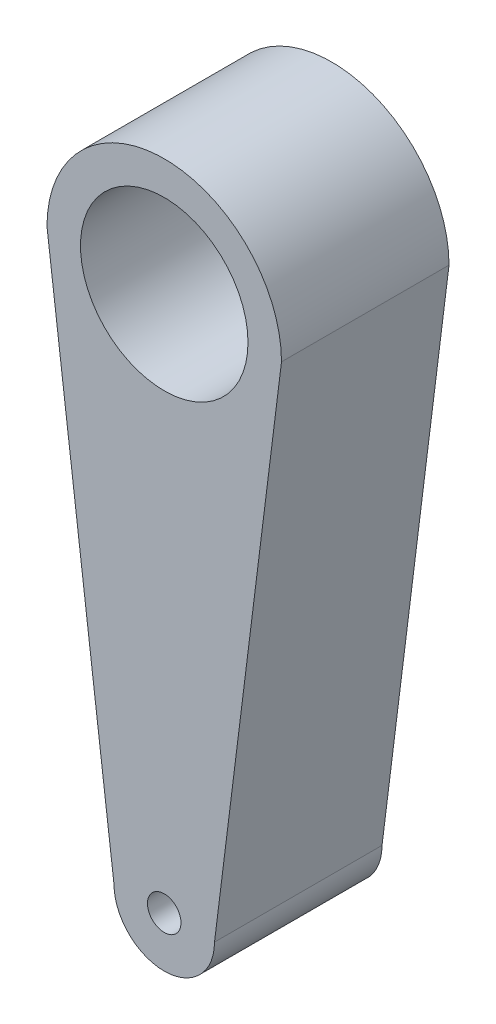
ISO-10303-21;
HEADER;
FILE_DESCRIPTION(('STEP AP214'),'2;1');
FILE_NAME('part.step','',(''),(''),'','','');
FILE_SCHEMA(('AUTOMOTIVE_DESIGN { 1 0 10303 214 1 1 1 1 }'));
ENDSEC;
DATA;
#1=APPLICATION_CONTEXT('core data for automotive mechanical design processes');
#2=APPLICATION_PROTOCOL_DEFINITION('international standard','automotive_design',2000,#1);
#3=PRODUCT_CONTEXT('',#1,'mechanical');
#4=PRODUCT('Part','Part','',(#3));
#5=PRODUCT_RELATED_PRODUCT_CATEGORY('part','',(#4));
#6=PRODUCT_DEFINITION_FORMATION('','',#4);
#7=PRODUCT_DEFINITION_CONTEXT('part definition',#1,'design');
#8=PRODUCT_DEFINITION('design','',#6,#7);
#9=PRODUCT_DEFINITION_SHAPE('','',#8);
#10=(LENGTH_UNIT() NAMED_UNIT(*) SI_UNIT(.MILLI.,.METRE.));
#11=(NAMED_UNIT(*) PLANE_ANGLE_UNIT() SI_UNIT($,.RADIAN.));
#12=(NAMED_UNIT(*) SI_UNIT($,.STERADIAN.) SOLID_ANGLE_UNIT());
#13=UNCERTAINTY_MEASURE_WITH_UNIT(LENGTH_MEASURE(1.E-05),#10,'distance_accuracy_value','');
#14=(GEOMETRIC_REPRESENTATION_CONTEXT(3) GLOBAL_UNCERTAINTY_ASSIGNED_CONTEXT((#13)) GLOBAL_UNIT_ASSIGNED_CONTEXT((#10,
#11,#12)) REPRESENTATION_CONTEXT('',''));
#15=CARTESIAN_POINT('',(0.,0.,0.));
#16=DIRECTION('',(0.,0.,1.));
#17=DIRECTION('',(1.,0.,0.));
#18=AXIS2_PLACEMENT_3D('',#15,#16,#17);
#19=CARTESIAN_POINT('',(0.,0.,5.));
#20=DIRECTION('',(0.,0.,1.));
#21=DIRECTION('',(1.,0.,0.));
#22=AXIS2_PLACEMENT_3D('',#19,#20,#21);
#23=PLANE('',#22);
#24=CARTESIAN_POINT('',(0.,0.,5.));
#25=DIRECTION('',(0.,0.,1.));
#26=DIRECTION('',(1.,0.,0.));
#27=AXIS2_PLACEMENT_3D('',#24,#25,#26);
#28=CIRCLE('',#27,2.5);
#29=CARTESIAN_POINT('',(2.5,0.,5.));
#30=VERTEX_POINT('',#29);
#31=EDGE_CURVE('E100',#30,#30,#28,.T.);
#32=ORIENTED_EDGE('',*,*,#31,.F.);
#33=EDGE_LOOP('',(#32));
#34=FACE_BOUND('',#33,.T.);
#35=CARTESIAN_POINT('',(0.,0.,5.));
#36=DIRECTION('',(0.,0.,1.));
#37=DIRECTION('',(1.,0.,0.));
#38=AXIS2_PLACEMENT_3D('',#35,#36,#37);
#39=CIRCLE('',#38,3.5);
#40=CARTESIAN_POINT('',(3.5,0.,5.));
#41=VERTEX_POINT('',#40);
#42=CARTESIAN_POINT('',(-3.5,0.,5.));
#43=VERTEX_POINT('',#42);
#44=EDGE_CURVE('E85',#41,#43,#39,.T.);
#45=ORIENTED_EDGE('',*,*,#44,.T.);
#46=DIRECTION('',(0.124034734589208,-0.992277876713668,0.));
#47=VECTOR('',#46,1.);
#48=CARTESIAN_POINT('',(-3.5,0.,5.));
#49=LINE('',#48,#47);
#50=CARTESIAN_POINT('',(-1.5,-16.,5.));
#51=VERTEX_POINT('',#50);
#52=EDGE_CURVE('E80',#43,#51,#49,.T.);
#53=ORIENTED_EDGE('',*,*,#52,.T.);
#54=CARTESIAN_POINT('',(0.,-16.,5.));
#55=DIRECTION('',(0.,0.,1.));
#56=DIRECTION('',(1.,0.,0.));
#57=AXIS2_PLACEMENT_3D('',#54,#55,#56);
#58=CIRCLE('',#57,1.5);
#59=CARTESIAN_POINT('',(1.5,-16.,5.));
#60=VERTEX_POINT('',#59);
#61=EDGE_CURVE('E83',#51,#60,#58,.T.);
#62=ORIENTED_EDGE('',*,*,#61,.T.);
#63=DIRECTION('',(0.124034734589208,0.992277876713668,0.));
#64=VECTOR('',#63,1.);
#65=CARTESIAN_POINT('',(3.5,0.,5.));
#66=LINE('',#65,#64);
#67=EDGE_CURVE('E50',#60,#41,#66,.T.);
#68=ORIENTED_EDGE('',*,*,#67,.T.);
#69=EDGE_LOOP('',(#45,#53,#62,#68));
#70=FACE_BOUND('',#69,.T.);
#71=CARTESIAN_POINT('',(0.,-16.,5.));
#72=DIRECTION('',(0.,0.,1.));
#73=DIRECTION('',(1.,0.,0.));
#74=AXIS2_PLACEMENT_3D('',#71,#72,#73);
#75=CIRCLE('',#74,0.5);
#76=CARTESIAN_POINT('',(0.5,-16.,5.));
#77=VERTEX_POINT('',#76);
#78=EDGE_CURVE('E115',#77,#77,#75,.T.);
#79=ORIENTED_EDGE('',*,*,#78,.F.);
#80=EDGE_LOOP('',(#79));
#81=FACE_BOUND('',#80,.T.);
#82=ADVANCED_FACE('F33',(#34,#70,#81),#23,.T.);
#83=CARTESIAN_POINT('',(0.,0.,0.));
#84=DIRECTION('',(0.,0.,1.));
#85=DIRECTION('',(1.,0.,0.));
#86=AXIS2_PLACEMENT_3D('',#83,#84,#85);
#87=PLANE('',#86);
#88=CARTESIAN_POINT('',(0.,0.,0.));
#89=DIRECTION('',(0.,0.,1.));
#90=DIRECTION('',(1.,0.,0.));
#91=AXIS2_PLACEMENT_3D('',#88,#89,#90);
#92=CIRCLE('',#91,3.5);
#93=CARTESIAN_POINT('',(3.5,0.,0.));
#94=VERTEX_POINT('',#93);
#95=CARTESIAN_POINT('',(-3.5,0.,0.));
#96=VERTEX_POINT('',#95);
#97=EDGE_CURVE('E97',#94,#96,#92,.T.);
#98=ORIENTED_EDGE('',*,*,#97,.F.);
#99=DIRECTION('',(0.124034734589208,0.992277876713668,0.));
#100=VECTOR('',#99,1.);
#101=CARTESIAN_POINT('',(3.5,0.,0.));
#102=LINE('',#101,#100);
#103=CARTESIAN_POINT('',(1.5,-16.,0.));
#104=VERTEX_POINT('',#103);
#105=EDGE_CURVE('E73',#104,#94,#102,.T.);
#106=ORIENTED_EDGE('',*,*,#105,.F.);
#107=CARTESIAN_POINT('',(0.,-16.,0.));
#108=DIRECTION('',(0.,0.,1.));
#109=DIRECTION('',(1.,0.,0.));
#110=AXIS2_PLACEMENT_3D('',#107,#108,#109);
#111=CIRCLE('',#110,1.5);
#112=CARTESIAN_POINT('',(-1.5,-16.,0.));
#113=VERTEX_POINT('',#112);
#114=EDGE_CURVE('E67',#113,#104,#111,.T.);
#115=ORIENTED_EDGE('',*,*,#114,.F.);
#116=DIRECTION('',(0.124034734589208,-0.992277876713668,0.));
#117=VECTOR('',#116,1.);
#118=CARTESIAN_POINT('',(-3.5,0.,0.));
#119=LINE('',#118,#117);
#120=EDGE_CURVE('E89',#96,#113,#119,.T.);
#121=ORIENTED_EDGE('',*,*,#120,.F.);
#122=EDGE_LOOP('',(#98,#106,#115,#121));
#123=FACE_BOUND('',#122,.T.);
#124=CARTESIAN_POINT('',(0.,0.,0.));
#125=DIRECTION('',(0.,0.,1.));
#126=DIRECTION('',(1.,0.,0.));
#127=AXIS2_PLACEMENT_3D('',#124,#125,#126);
#128=CIRCLE('',#127,2.5);
#129=CARTESIAN_POINT('',(2.5,0.,0.));
#130=VERTEX_POINT('',#129);
#131=EDGE_CURVE('E112',#130,#130,#128,.T.);
#132=ORIENTED_EDGE('',*,*,#131,.T.);
#133=EDGE_LOOP('',(#132));
#134=FACE_BOUND('',#133,.T.);
#135=CARTESIAN_POINT('',(0.,-16.,0.));
#136=DIRECTION('',(0.,0.,1.));
#137=DIRECTION('',(1.,0.,0.));
#138=AXIS2_PLACEMENT_3D('',#135,#136,#137);
#139=CIRCLE('',#138,0.5);
#140=CARTESIAN_POINT('',(0.5,-16.,0.));
#141=VERTEX_POINT('',#140);
#142=EDGE_CURVE('E118',#141,#141,#139,.T.);
#143=ORIENTED_EDGE('',*,*,#142,.T.);
#144=EDGE_LOOP('',(#143));
#145=FACE_BOUND('',#144,.T.);
#146=ADVANCED_FACE('F108',(#123,#134,#145),#87,.F.);
#147=CARTESIAN_POINT('',(0.,0.,5.));
#148=DIRECTION('',(0.,0.,-1.));
#149=DIRECTION('',(-1.,0.,0.));
#150=AXIS2_PLACEMENT_3D('',#147,#148,#149);
#151=CYLINDRICAL_SURFACE('',#150,3.5);
#152=ORIENTED_EDGE('',*,*,#97,.T.);
#153=DIRECTION('',(0.,0.,-1.));
#154=VECTOR('',#153,1.);
#155=CARTESIAN_POINT('',(-3.5,0.,5.));
#156=LINE('',#155,#154);
#157=EDGE_CURVE('E11',#43,#96,#156,.T.);
#158=ORIENTED_EDGE('',*,*,#157,.F.);
#159=ORIENTED_EDGE('',*,*,#44,.F.);
#160=DIRECTION('',(0.,0.,-1.));
#161=VECTOR('',#160,1.);
#162=CARTESIAN_POINT('',(3.5,0.,5.));
#163=LINE('',#162,#161);
#164=EDGE_CURVE('E93',#41,#94,#163,.T.);
#165=ORIENTED_EDGE('',*,*,#164,.T.);
#166=EDGE_LOOP('',(#152,#158,#159,#165));
#167=FACE_BOUND('',#166,.T.);
#168=ADVANCED_FACE('F35',(#167),#151,.T.);
#169=CARTESIAN_POINT('',(-3.5,0.,5.));
#170=DIRECTION('',(0.992277876713668,0.124034734589208,0.));
#171=DIRECTION('',(-0.124034734589208,0.992277876713668,0.));
#172=AXIS2_PLACEMENT_3D('',#169,#170,#171);
#173=PLANE('',#172);
#174=ORIENTED_EDGE('',*,*,#120,.T.);
#175=DIRECTION('',(0.,0.,-1.));
#176=VECTOR('',#175,1.);
#177=CARTESIAN_POINT('',(-1.5,-16.,5.));
#178=LINE('',#177,#176);
#179=EDGE_CURVE('E42',#51,#113,#178,.T.);
#180=ORIENTED_EDGE('',*,*,#179,.F.);
#181=ORIENTED_EDGE('',*,*,#52,.F.);
#182=ORIENTED_EDGE('',*,*,#157,.T.);
#183=EDGE_LOOP('',(#174,#180,#181,#182));
#184=FACE_BOUND('',#183,.T.);
#185=ADVANCED_FACE('F88',(#184),#173,.F.);
#186=CARTESIAN_POINT('',(0.,-16.,5.));
#187=DIRECTION('',(0.,0.,-1.));
#188=DIRECTION('',(-1.,0.,0.));
#189=AXIS2_PLACEMENT_3D('',#186,#187,#188);
#190=CYLINDRICAL_SURFACE('',#189,1.5);
#191=ORIENTED_EDGE('',*,*,#114,.T.);
#192=DIRECTION('',(0.,0.,-1.));
#193=VECTOR('',#192,1.);
#194=CARTESIAN_POINT('',(1.5,-16.,5.));
#195=LINE('',#194,#193);
#196=EDGE_CURVE('E90',#60,#104,#195,.T.);
#197=ORIENTED_EDGE('',*,*,#196,.F.);
#198=ORIENTED_EDGE('',*,*,#61,.F.);
#199=ORIENTED_EDGE('',*,*,#179,.T.);
#200=EDGE_LOOP('',(#191,#197,#198,#199));
#201=FACE_BOUND('',#200,.T.);
#202=ADVANCED_FACE('F91',(#201),#190,.T.);
#203=CARTESIAN_POINT('',(3.5,0.,5.));
#204=DIRECTION('',(-0.992277876713668,0.124034734589208,0.));
#205=DIRECTION('',(-0.124034734589208,-0.992277876713668,0.));
#206=AXIS2_PLACEMENT_3D('',#203,#204,#205);
#207=PLANE('',#206);
#208=ORIENTED_EDGE('',*,*,#105,.T.);
#209=ORIENTED_EDGE('',*,*,#164,.F.);
#210=ORIENTED_EDGE('',*,*,#67,.F.);
#211=ORIENTED_EDGE('',*,*,#196,.T.);
#212=EDGE_LOOP('',(#208,#209,#210,#211));
#213=FACE_BOUND('',#212,.T.);
#214=ADVANCED_FACE('F105',(#213),#207,.F.);
#215=CARTESIAN_POINT('',(0.,0.,5.));
#216=DIRECTION('',(0.,0.,-1.));
#217=DIRECTION('',(-1.,0.,0.));
#218=AXIS2_PLACEMENT_3D('',#215,#216,#217);
#219=CYLINDRICAL_SURFACE('',#218,2.5);
#220=ORIENTED_EDGE('',*,*,#31,.T.);
#221=EDGE_LOOP('',(#220));
#222=FACE_BOUND('',#221,.T.);
#223=ORIENTED_EDGE('',*,*,#131,.F.);
#224=EDGE_LOOP('',(#223));
#225=FACE_BOUND('',#224,.T.);
#226=ADVANCED_FACE('F135',(#222,#225),#219,.F.);
#227=CARTESIAN_POINT('',(0.,-16.,5.));
#228=DIRECTION('',(0.,0.,-1.));
#229=DIRECTION('',(-1.,0.,0.));
#230=AXIS2_PLACEMENT_3D('',#227,#228,#229);
#231=CYLINDRICAL_SURFACE('',#230,0.5);
#232=ORIENTED_EDGE('',*,*,#78,.T.);
#233=EDGE_LOOP('',(#232));
#234=FACE_BOUND('',#233,.T.);
#235=ORIENTED_EDGE('',*,*,#142,.F.);
#236=EDGE_LOOP('',(#235));
#237=FACE_BOUND('',#236,.T.);
#238=ADVANCED_FACE('F124',(#234,#237),#231,.F.);
#239=CLOSED_SHELL('',(#82,#146,#168,#185,#202,#214,#226,#238));
#240=MANIFOLD_SOLID_BREP('B2',#239);
#241=ADVANCED_BREP_SHAPE_REPRESENTATION('',(#18,#240),#14);
#242=SHAPE_DEFINITION_REPRESENTATION(#9,#241);
ENDSEC;
END-ISO-10303-21;
